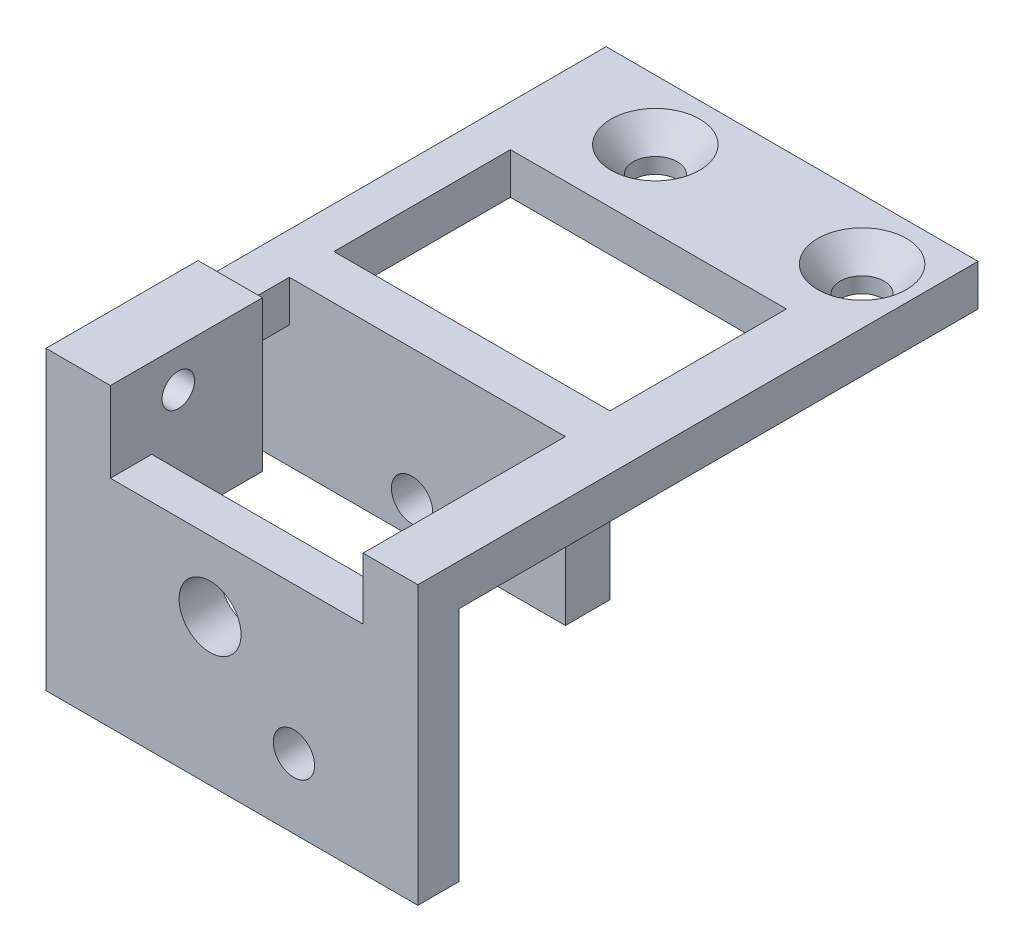
ISO-10303-21;
HEADER;
FILE_DESCRIPTION(('STEP AP214'),'2;1');
FILE_NAME('part.step','',(''),(''),'','','');
FILE_SCHEMA(('AUTOMOTIVE_DESIGN { 1 0 10303 214 1 1 1 1 }'));
ENDSEC;
DATA;
#1=APPLICATION_CONTEXT('core data for automotive mechanical design processes');
#2=APPLICATION_PROTOCOL_DEFINITION('international standard','automotive_design',2000,#1);
#3=PRODUCT_CONTEXT('',#1,'mechanical');
#4=PRODUCT('Part','Part','',(#3));
#5=PRODUCT_RELATED_PRODUCT_CATEGORY('part','',(#4));
#6=PRODUCT_DEFINITION_FORMATION('','',#4);
#7=PRODUCT_DEFINITION_CONTEXT('part definition',#1,'design');
#8=PRODUCT_DEFINITION('design','',#6,#7);
#9=PRODUCT_DEFINITION_SHAPE('','',#8);
#10=(LENGTH_UNIT() NAMED_UNIT(*) SI_UNIT(.MILLI.,.METRE.));
#11=(NAMED_UNIT(*) PLANE_ANGLE_UNIT() SI_UNIT($,.RADIAN.));
#12=(NAMED_UNIT(*) SI_UNIT($,.STERADIAN.) SOLID_ANGLE_UNIT());
#13=UNCERTAINTY_MEASURE_WITH_UNIT(LENGTH_MEASURE(1.E-05),#10,'distance_accuracy_value','');
#14=(GEOMETRIC_REPRESENTATION_CONTEXT(3) GLOBAL_UNCERTAINTY_ASSIGNED_CONTEXT((#13)) GLOBAL_UNIT_ASSIGNED_CONTEXT((#10,
#11,#12)) REPRESENTATION_CONTEXT('',''));
#15=CARTESIAN_POINT('',(0.,0.,0.));
#16=DIRECTION('',(0.,0.,1.));
#17=DIRECTION('',(1.,0.,0.));
#18=AXIS2_PLACEMENT_3D('',#15,#16,#17);
#19=CARTESIAN_POINT('',(-18.8578713163455,22.7197449567817,0.));
#20=DIRECTION('',(1.,0.,0.));
#21=DIRECTION('',(0.,0.,-1.));
#22=AXIS2_PLACEMENT_3D('',#19,#20,#21);
#23=PLANE('',#22);
#24=DIRECTION('',(0.,-1.,0.));
#25=VECTOR('',#24,1.);
#26=CARTESIAN_POINT('',(-18.8578713163455,22.7197449567817,-31.0499999999992));
#27=LINE('',#26,#25);
#28=CARTESIAN_POINT('',(-18.8578713163455,29.0697449567817,-31.0499999999992));
#29=VERTEX_POINT('',#28);
#30=CARTESIAN_POINT('',(-18.8578713163455,22.7197449567817,-31.0499999999992));
#31=VERTEX_POINT('',#30);
#32=EDGE_CURVE('E242',#29,#31,#27,.T.);
#33=ORIENTED_EDGE('',*,*,#32,.F.);
#34=DIRECTION('',(0.,0.,-1.));
#35=VECTOR('',#34,1.);
#36=CARTESIAN_POINT('',(-18.8578713163455,29.0697449567817,0.));
#37=LINE('',#36,#35);
#38=CARTESIAN_POINT('',(-18.8578713163455,29.0697449567817,-23.368));
#39=VERTEX_POINT('',#38);
#40=EDGE_CURVE('E313',#39,#29,#37,.T.);
#41=ORIENTED_EDGE('',*,*,#40,.F.);
#42=DIRECTION('',(0.,1.,0.));
#43=VECTOR('',#42,1.);
#44=CARTESIAN_POINT('',(-18.8578713163455,0.,-23.368));
#45=LINE('',#44,#43);
#46=CARTESIAN_POINT('',(-18.8578713163455,22.7197449567817,-23.368));
#47=VERTEX_POINT('',#46);
#48=EDGE_CURVE('E412',#47,#39,#45,.T.);
#49=ORIENTED_EDGE('',*,*,#48,.F.);
#50=DIRECTION('',(0.,0.,-1.));
#51=VECTOR('',#50,1.);
#52=CARTESIAN_POINT('',(-18.8578713163455,22.7197449567817,0.));
#53=LINE('',#52,#51);
#54=EDGE_CURVE('E304',#47,#31,#53,.T.);
#55=ORIENTED_EDGE('',*,*,#54,.T.);
#56=EDGE_LOOP('',(#33,#41,#49,#55));
#57=FACE_BOUND('',#56,.T.);
#58=ADVANCED_FACE('F37',(#57),#23,.T.);
#59=CARTESIAN_POINT('',(0.,22.7197449567817,0.));
#60=DIRECTION('',(0.,1.,0.));
#61=DIRECTION('',(0.,0.,1.));
#62=AXIS2_PLACEMENT_3D('',#59,#60,#61);
#63=PLANE('',#62);
#64=DIRECTION('',(0.,0.,1.));
#65=VECTOR('',#64,1.);
#66=CARTESIAN_POINT('',(-25.2078713163455,22.7197449567817,0.));
#67=LINE('',#66,#65);
#68=CARTESIAN_POINT('',(-25.2078713163455,22.7197449567817,-31.0499999999992));
#69=VERTEX_POINT('',#68);
#70=CARTESIAN_POINT('',(-25.2078713163455,22.7197449567817,-23.368));
#71=VERTEX_POINT('',#70);
#72=EDGE_CURVE('E307',#69,#71,#67,.T.);
#73=ORIENTED_EDGE('',*,*,#72,.F.);
#74=DIRECTION('',(1.,0.,0.));
#75=VECTOR('',#74,1.);
#76=CARTESIAN_POINT('',(0.,22.7197449567817,-31.0499999999992));
#77=LINE('',#76,#75);
#78=EDGE_CURVE('E239',#69,#31,#77,.T.);
#79=ORIENTED_EDGE('',*,*,#78,.T.);
#80=ORIENTED_EDGE('',*,*,#54,.F.);
#81=DIRECTION('',(-1.,0.,0.));
#82=VECTOR('',#81,1.);
#83=CARTESIAN_POINT('',(0.,22.7197449567817,-23.368));
#84=LINE('',#83,#82);
#85=EDGE_CURVE('E415',#47,#71,#84,.T.);
#86=ORIENTED_EDGE('',*,*,#85,.T.);
#87=EDGE_LOOP('',(#73,#79,#80,#86));
#88=FACE_BOUND('',#87,.T.);
#89=ADVANCED_FACE('F442',(#88),#63,.F.);
#90=CARTESIAN_POINT('',(23.5601286836545,22.7197449567817,0.));
#91=DIRECTION('',(-1.,0.,0.));
#92=DIRECTION('',(0.,0.,1.));
#93=AXIS2_PLACEMENT_3D('',#90,#91,#92);
#94=PLANE('',#93);
#95=DIRECTION('',(0.,1.,0.));
#96=VECTOR('',#95,1.);
#97=CARTESIAN_POINT('',(23.5601286836545,22.7197449567817,-31.0499999999993));
#98=LINE('',#97,#96);
#99=CARTESIAN_POINT('',(23.5601286836545,22.7197449567817,-31.0499999999993));
#100=VERTEX_POINT('',#99);
#101=CARTESIAN_POINT('',(23.5601286836545,29.0697449567817,-31.0499999999992));
#102=VERTEX_POINT('',#101);
#103=EDGE_CURVE('E11',#100,#102,#98,.T.);
#104=ORIENTED_EDGE('',*,*,#103,.F.);
#105=DIRECTION('',(0.,0.,1.));
#106=VECTOR('',#105,1.);
#107=CARTESIAN_POINT('',(23.5601286836545,22.7197449567817,0.));
#108=LINE('',#107,#106);
#109=CARTESIAN_POINT('',(23.5601286836545,22.7197449567817,-6.35));
#110=VERTEX_POINT('',#109);
#111=EDGE_CURVE('E289',#100,#110,#108,.T.);
#112=ORIENTED_EDGE('',*,*,#111,.T.);
#113=DIRECTION('',(0.,1.,0.));
#114=VECTOR('',#113,1.);
#115=CARTESIAN_POINT('',(23.5601286836545,0.,-6.35));
#116=LINE('',#115,#114);
#117=CARTESIAN_POINT('',(23.5601286836545,29.0697449567817,-6.35));
#118=VERTEX_POINT('',#117);
#119=EDGE_CURVE('E300',#110,#118,#116,.T.);
#120=ORIENTED_EDGE('',*,*,#119,.T.);
#121=DIRECTION('',(0.,0.,1.));
#122=VECTOR('',#121,1.);
#123=CARTESIAN_POINT('',(23.5601286836545,29.0697449567817,0.));
#124=LINE('',#123,#122);
#125=EDGE_CURVE('E286',#102,#118,#124,.T.);
#126=ORIENTED_EDGE('',*,*,#125,.F.);
#127=EDGE_LOOP('',(#104,#112,#120,#126));
#128=FACE_BOUND('',#127,.T.);
#129=ADVANCED_FACE('F449',(#128),#94,.T.);
#130=CARTESIAN_POINT('',(0.,0.,-23.368));
#131=DIRECTION('',(0.,0.,1.));
#132=DIRECTION('',(1.,0.,0.));
#133=AXIS2_PLACEMENT_3D('',#130,#131,#132);
#134=PLANE('',#133);
#135=ORIENTED_EDGE('',*,*,#85,.F.);
#136=ORIENTED_EDGE('',*,*,#48,.T.);
#137=DIRECTION('',(-1.,0.,0.));
#138=VECTOR('',#137,1.);
#139=CARTESIAN_POINT('',(0.,29.0697449567817,-23.368));
#140=LINE('',#139,#138);
#141=CARTESIAN_POINT('',(-25.2078713163455,29.0697449567817,-23.368));
#142=VERTEX_POINT('',#141);
#143=EDGE_CURVE('E392',#39,#142,#140,.T.);
#144=ORIENTED_EDGE('',*,*,#143,.T.);
#145=DIRECTION('',(0.,-1.,0.));
#146=VECTOR('',#145,1.);
#147=CARTESIAN_POINT('',(-25.2078713163455,0.,-23.368));
#148=LINE('',#147,#146);
#149=CARTESIAN_POINT('',(-25.2078713163455,31.9581967213115,-23.368));
#150=VERTEX_POINT('',#149);
#151=EDGE_CURVE('E325',#150,#142,#148,.T.);
#152=ORIENTED_EDGE('',*,*,#151,.F.);
#153=DIRECTION('',(-1.,0.,0.));
#154=VECTOR('',#153,1.);
#155=CARTESIAN_POINT('',(0.,31.9581967213115,-23.368));
#156=LINE('',#155,#154);
#157=CARTESIAN_POINT('',(-15.3109469053674,31.9581967213115,-23.368));
#158=VERTEX_POINT('',#157);
#159=EDGE_CURVE('E321',#158,#150,#156,.T.);
#160=ORIENTED_EDGE('',*,*,#159,.F.);
#161=DIRECTION('',(0.,-1.,0.));
#162=VECTOR('',#161,1.);
#163=CARTESIAN_POINT('',(-15.3109469053674,0.,-23.368));
#164=LINE('',#163,#162);
#165=CARTESIAN_POINT('',(-15.3109469053674,8.84419672131148,-23.368));
#166=VERTEX_POINT('',#165);
#167=EDGE_CURVE('E319',#158,#166,#164,.T.);
#168=ORIENTED_EDGE('',*,*,#167,.T.);
#169=DIRECTION('',(-1.,0.,0.));
#170=VECTOR('',#169,1.);
#171=CARTESIAN_POINT('',(0.,8.84419672131148,-23.368));
#172=LINE('',#171,#170);
#173=CARTESIAN_POINT('',(-25.2078713163455,8.84419672131148,-23.368));
#174=VERTEX_POINT('',#173);
#175=EDGE_CURVE('E312',#166,#174,#172,.T.);
#176=ORIENTED_EDGE('',*,*,#175,.T.);
#177=EDGE_CURVE('E324',#71,#174,#148,.T.);
#178=ORIENTED_EDGE('',*,*,#177,.F.);
#179=EDGE_LOOP('',(#135,#136,#144,#152,#160,#168,#176,#178));
#180=FACE_BOUND('',#179,.T.);
#181=ADVANCED_FACE('F546',(#180),#134,.F.);
#182=CARTESIAN_POINT('',(0.,0.,-6.35));
#183=DIRECTION('',(0.,0.,-1.));
#184=DIRECTION('',(-1.,0.,0.));
#185=AXIS2_PLACEMENT_3D('',#182,#183,#184);
#186=PLANE('',#185);
#187=ORIENTED_EDGE('',*,*,#119,.F.);
#188=DIRECTION('',(1.,0.,0.));
#189=VECTOR('',#188,1.);
#190=CARTESIAN_POINT('',(0.,22.7197449567817,-6.35));
#191=LINE('',#190,#189);
#192=CARTESIAN_POINT('',(31.9421286836545,22.7197449567817,-6.35));
#193=VERTEX_POINT('',#192);
#194=EDGE_CURVE('E294',#110,#193,#191,.T.);
#195=ORIENTED_EDGE('',*,*,#194,.T.);
#196=DIRECTION('',(0.,1.,0.));
#197=VECTOR('',#196,1.);
#198=CARTESIAN_POINT('',(31.9421286836545,29.0697449567817,-6.35));
#199=LINE('',#198,#197);
#200=CARTESIAN_POINT('',(31.9421286836545,-13.6022550432183,-6.35));
#201=VERTEX_POINT('',#200);
#202=EDGE_CURVE('E358',#201,#193,#199,.T.);
#203=ORIENTED_EDGE('',*,*,#202,.F.);
#204=DIRECTION('',(1.,0.,0.));
#205=VECTOR('',#204,1.);
#206=CARTESIAN_POINT('',(-25.2078713163455,-13.6022550432183,-6.35));
#207=LINE('',#206,#205);
#208=CARTESIAN_POINT('',(-25.2078713163455,-13.6022550432183,-6.35));
#209=VERTEX_POINT('',#208);
#210=EDGE_CURVE('E354',#209,#201,#207,.T.);
#211=ORIENTED_EDGE('',*,*,#210,.F.);
#212=DIRECTION('',(0.,-1.,0.));
#213=VECTOR('',#212,1.);
#214=CARTESIAN_POINT('',(-25.2078713163455,8.84419672131148,-6.35));
#215=LINE('',#214,#213);
#216=CARTESIAN_POINT('',(-25.2078713163455,8.84419672131148,-6.35));
#217=VERTEX_POINT('',#216);
#218=EDGE_CURVE('E352',#217,#209,#215,.T.);
#219=ORIENTED_EDGE('',*,*,#218,.F.);
#220=DIRECTION('',(1.,0.,0.));
#221=VECTOR('',#220,1.);
#222=CARTESIAN_POINT('',(0.,8.84419672131148,-6.35));
#223=LINE('',#222,#221);
#224=CARTESIAN_POINT('',(-15.3109469053674,8.84419672131148,-6.35));
#225=VERTEX_POINT('',#224);
#226=EDGE_CURVE('E336',#217,#225,#223,.T.);
#227=ORIENTED_EDGE('',*,*,#226,.T.);
#228=DIRECTION('',(0.,1.,0.));
#229=VECTOR('',#228,1.);
#230=CARTESIAN_POINT('',(-15.3109469053674,0.,-6.35));
#231=LINE('',#230,#229);
#232=CARTESIAN_POINT('',(-15.3109469053674,19.6202999936889,-6.35));
#233=VERTEX_POINT('',#232);
#234=EDGE_CURVE('E332',#225,#233,#231,.T.);
#235=ORIENTED_EDGE('',*,*,#234,.T.);
#236=DIRECTION('',(-1.,0.,0.));
#237=VECTOR('',#236,1.);
#238=CARTESIAN_POINT('',(-15.3109469053674,19.6202999936889,-6.35));
#239=LINE('',#238,#237);
#240=CARTESIAN_POINT('',(23.5226051795746,19.6202999936889,-6.35));
#241=VERTEX_POINT('',#240);
#242=EDGE_CURVE('E365',#241,#233,#239,.T.);
#243=ORIENTED_EDGE('',*,*,#242,.F.);
#244=DIRECTION('',(0.,-1.,0.));
#245=VECTOR('',#244,1.);
#246=CARTESIAN_POINT('',(23.5226051795746,22.6564717057016,-6.35));
#247=LINE('',#246,#245);
#248=CARTESIAN_POINT('',(23.5226051795746,29.0697449567817,-6.35));
#249=VERTEX_POINT('',#248);
#250=EDGE_CURVE('E363',#249,#241,#247,.T.);
#251=ORIENTED_EDGE('',*,*,#250,.F.);
#252=DIRECTION('',(-1.,0.,0.));
#253=VECTOR('',#252,1.);
#254=CARTESIAN_POINT('',(23.5226051795746,29.0697449567817,-6.35));
#255=LINE('',#254,#253);
#256=EDGE_CURVE('E361',#118,#249,#255,.T.);
#257=ORIENTED_EDGE('',*,*,#256,.F.);
#258=EDGE_LOOP('',(#187,#195,#203,#211,#219,#227,#235,#243,#251,#257));
#259=FACE_BOUND('',#258,.T.);
#260=CARTESIAN_POINT('',(6.65235973945633E-08,8.84419672131148,-6.35));
#261=DIRECTION('',(0.,0.,1.));
#262=DIRECTION('',(1.,0.,0.));
#263=AXIS2_PLACEMENT_3D('',#260,#261,#262);
#264=CIRCLE('',#263,4.76249999893999);
#265=CARTESIAN_POINT('',(4.76250006546358,8.84419672131148,-6.35));
#266=VERTEX_POINT('',#265);
#267=EDGE_CURVE('E340',#266,#266,#264,.T.);
#268=ORIENTED_EDGE('',*,*,#267,.T.);
#269=EDGE_LOOP('',(#268));
#270=FACE_BOUND('',#269,.T.);
#271=CARTESIAN_POINT('',(12.8921286836545,-2.93425504321831,-6.35));
#272=DIRECTION('',(0.,0.,1.));
#273=DIRECTION('',(1.,0.,0.));
#274=AXIS2_PLACEMENT_3D('',#271,#272,#273);
#275=CIRCLE('',#274,3.175);
#276=CARTESIAN_POINT('',(16.0671286836545,-2.93425504321831,-6.35));
#277=VERTEX_POINT('',#276);
#278=EDGE_CURVE('E346',#277,#277,#275,.T.);
#279=ORIENTED_EDGE('',*,*,#278,.T.);
#280=EDGE_LOOP('',(#279));
#281=FACE_BOUND('',#280,.T.);
#282=ADVANCED_FACE('F521',(#259,#270,#281),#186,.T.);
#283=CARTESIAN_POINT('',(-25.2078713163455,31.9581967213115,-6.35));
#284=DIRECTION('',(0.,1.,0.));
#285=DIRECTION('',(0.,0.,1.));
#286=AXIS2_PLACEMENT_3D('',#283,#284,#285);
#287=PLANE('',#286);
#288=DIRECTION('',(-1.,0.,0.));
#289=VECTOR('',#288,1.);
#290=CARTESIAN_POINT('',(-25.2078713163455,31.9581967213115,0.));
#291=LINE('',#290,#289);
#292=CARTESIAN_POINT('',(-15.3109469053674,31.9581967213115,0.));
#293=VERTEX_POINT('',#292);
#294=CARTESIAN_POINT('',(-25.2078713163455,31.9581967213115,0.));
#295=VERTEX_POINT('',#294);
#296=EDGE_CURVE('E355',#293,#295,#291,.T.);
#297=ORIENTED_EDGE('',*,*,#296,.F.);
#298=DIRECTION('',(0.,0.,1.));
#299=VECTOR('',#298,1.);
#300=CARTESIAN_POINT('',(-15.3109469053674,31.9581967213115,-6.35));
#301=LINE('',#300,#299);
#302=EDGE_CURVE('E393',#158,#293,#301,.T.);
#303=ORIENTED_EDGE('',*,*,#302,.F.);
#304=ORIENTED_EDGE('',*,*,#159,.T.);
#305=DIRECTION('',(0.,0.,1.));
#306=VECTOR('',#305,1.);
#307=CARTESIAN_POINT('',(-25.2078713163455,31.9581967213115,-6.35));
#308=LINE('',#307,#306);
#309=EDGE_CURVE('E389',#150,#295,#308,.T.);
#310=ORIENTED_EDGE('',*,*,#309,.T.);
#311=EDGE_LOOP('',(#297,#303,#304,#310));
#312=FACE_BOUND('',#311,.T.);
#313=ADVANCED_FACE('F541',(#312),#287,.T.);
#314=CARTESIAN_POINT('',(-15.3109469053674,31.9581967213115,-6.35));
#315=DIRECTION('',(1.,0.,0.));
#316=DIRECTION('',(0.,0.,-1.));
#317=AXIS2_PLACEMENT_3D('',#314,#315,#316);
#318=PLANE('',#317);
#319=CARTESIAN_POINT('',(-15.3109469053674,26.1623070820462,-10.4374991238568));
#320=DIRECTION('',(1.,0.,0.));
#321=DIRECTION('',(0.,0.,-1.));
#322=AXIS2_PLACEMENT_3D('',#319,#320,#321);
#323=CIRCLE('',#322,2.50000000000162);
#324=CARTESIAN_POINT('',(-15.3109469053674,26.1623070820462,-12.9374991238585));
#325=VERTEX_POINT('',#324);
#326=EDGE_CURVE('E280',#325,#325,#323,.F.);
#327=ORIENTED_EDGE('',*,*,#326,.T.);
#328=EDGE_LOOP('',(#327));
#329=FACE_BOUND('',#328,.T.);
#330=DIRECTION('',(0.,1.,0.));
#331=VECTOR('',#330,1.);
#332=CARTESIAN_POINT('',(-15.3109469053674,31.9581967213115,0.));
#333=LINE('',#332,#331);
#334=CARTESIAN_POINT('',(-15.3109469053674,19.6202999936889,0.));
#335=VERTEX_POINT('',#334);
#336=EDGE_CURVE('E384',#335,#293,#333,.T.);
#337=ORIENTED_EDGE('',*,*,#336,.F.);
#338=DIRECTION('',(0.,0.,1.));
#339=VECTOR('',#338,1.);
#340=CARTESIAN_POINT('',(-15.3109469053674,19.6202999936889,-6.35));
#341=LINE('',#340,#339);
#342=EDGE_CURVE('E396',#233,#335,#341,.T.);
#343=ORIENTED_EDGE('',*,*,#342,.F.);
#344=ORIENTED_EDGE('',*,*,#234,.F.);
#345=DIRECTION('',(0.,0.,1.));
#346=VECTOR('',#345,1.);
#347=CARTESIAN_POINT('',(-15.3109469053674,8.84419672131148,-23.368));
#348=LINE('',#347,#346);
#349=EDGE_CURVE('E328',#166,#225,#348,.T.);
#350=ORIENTED_EDGE('',*,*,#349,.F.);
#351=ORIENTED_EDGE('',*,*,#167,.F.);
#352=ORIENTED_EDGE('',*,*,#302,.T.);
#353=EDGE_LOOP('',(#337,#343,#344,#350,#351,#352));
#354=FACE_BOUND('',#353,.T.);
#355=ADVANCED_FACE('F536',(#329,#354),#318,.T.);
#356=CARTESIAN_POINT('',(-15.3109469053674,19.6202999936889,-6.35));
#357=DIRECTION('',(0.,1.,0.));
#358=DIRECTION('',(0.,0.,1.));
#359=AXIS2_PLACEMENT_3D('',#356,#357,#358);
#360=PLANE('',#359);
#361=DIRECTION('',(-1.,0.,0.));
#362=VECTOR('',#361,1.);
#363=CARTESIAN_POINT('',(-15.3109469053674,19.6202999936889,0.));
#364=LINE('',#363,#362);
#365=CARTESIAN_POINT('',(23.5226051795746,19.6202999936889,0.));
#366=VERTEX_POINT('',#365);
#367=EDGE_CURVE('E381',#366,#335,#364,.T.);
#368=ORIENTED_EDGE('',*,*,#367,.F.);
#369=DIRECTION('',(0.,0.,1.));
#370=VECTOR('',#369,1.);
#371=CARTESIAN_POINT('',(23.5226051795746,19.6202999936889,-6.35));
#372=LINE('',#371,#370);
#373=EDGE_CURVE('E399',#241,#366,#372,.T.);
#374=ORIENTED_EDGE('',*,*,#373,.F.);
#375=ORIENTED_EDGE('',*,*,#242,.T.);
#376=ORIENTED_EDGE('',*,*,#342,.T.);
#377=EDGE_LOOP('',(#368,#374,#375,#376));
#378=FACE_BOUND('',#377,.T.);
#379=ADVANCED_FACE('F498',(#378),#360,.T.);
#380=CARTESIAN_POINT('',(23.5226051795746,19.6202999936889,-6.35));
#381=DIRECTION('',(-1.,0.,0.));
#382=DIRECTION('',(0.,0.,1.));
#383=AXIS2_PLACEMENT_3D('',#380,#381,#382);
#384=PLANE('',#383);
#385=DIRECTION('',(0.,-1.,0.));
#386=VECTOR('',#385,1.);
#387=CARTESIAN_POINT('',(23.5226051795746,19.6202999936889,0.));
#388=LINE('',#387,#386);
#389=CARTESIAN_POINT('',(23.5226051795746,29.0697449567817,0.));
#390=VERTEX_POINT('',#389);
#391=EDGE_CURVE('E378',#390,#366,#388,.T.);
#392=ORIENTED_EDGE('',*,*,#391,.F.);
#393=DIRECTION('',(0.,0.,1.));
#394=VECTOR('',#393,1.);
#395=CARTESIAN_POINT('',(23.5226051795746,29.0697449567817,-6.35));
#396=LINE('',#395,#394);
#397=EDGE_CURVE('E401',#249,#390,#396,.T.);
#398=ORIENTED_EDGE('',*,*,#397,.F.);
#399=ORIENTED_EDGE('',*,*,#250,.T.);
#400=ORIENTED_EDGE('',*,*,#373,.T.);
#401=EDGE_LOOP('',(#392,#398,#399,#400));
#402=FACE_BOUND('',#401,.T.);
#403=ADVANCED_FACE('F484',(#402),#384,.T.);
#404=CARTESIAN_POINT('',(23.5226051795746,29.0697449567817,-6.35));
#405=DIRECTION('',(0.,1.,0.));
#406=DIRECTION('',(0.,0.,1.));
#407=AXIS2_PLACEMENT_3D('',#404,#405,#406);
#408=PLANE('',#407);
#409=DIRECTION('',(0.,0.,1.));
#410=VECTOR('',#409,1.);
#411=CARTESIAN_POINT('',(-25.2078713163455,29.0697449567817,0.));
#412=LINE('',#411,#410);
#413=CARTESIAN_POINT('',(-25.2078713163455,29.0697449567817,-86.0813347367588));
#414=VERTEX_POINT('',#413);
#415=EDGE_CURVE('E315',#414,#142,#412,.T.);
#416=ORIENTED_EDGE('',*,*,#415,.T.);
#417=ORIENTED_EDGE('',*,*,#143,.F.);
#418=ORIENTED_EDGE('',*,*,#40,.T.);
#419=DIRECTION('',(1.,0.,0.));
#420=VECTOR('',#419,1.);
#421=CARTESIAN_POINT('',(23.5601286836545,29.0697449567817,-31.0499999999993));
#422=LINE('',#421,#420);
#423=EDGE_CURVE('E60',#29,#102,#422,.T.);
#424=ORIENTED_EDGE('',*,*,#423,.T.);
#425=ORIENTED_EDGE('',*,*,#125,.T.);
#426=ORIENTED_EDGE('',*,*,#256,.T.);
#427=ORIENTED_EDGE('',*,*,#397,.T.);
#428=DIRECTION('',(-1.,0.,0.));
#429=VECTOR('',#428,1.);
#430=CARTESIAN_POINT('',(23.5226051795746,29.0697449567817,0.));
#431=LINE('',#430,#429);
#432=CARTESIAN_POINT('',(31.9421286836545,29.0697449567817,0.));
#433=VERTEX_POINT('',#432);
#434=EDGE_CURVE('E376',#433,#390,#431,.T.);
#435=ORIENTED_EDGE('',*,*,#434,.F.);
#436=DIRECTION('',(0.,0.,1.));
#437=VECTOR('',#436,1.);
#438=CARTESIAN_POINT('',(31.9421286836545,29.0697449567817,-6.35));
#439=LINE('',#438,#437);
#440=CARTESIAN_POINT('',(31.9421286836545,29.0697449567817,-86.0813347367588));
#441=VERTEX_POINT('',#440);
#442=EDGE_CURVE('E404',#441,#433,#439,.T.);
#443=ORIENTED_EDGE('',*,*,#442,.F.);
#444=DIRECTION('',(-1.,0.,0.));
#445=VECTOR('',#444,1.);
#446=CARTESIAN_POINT('',(-25.2078713163455,29.0697449567817,-86.0813347367588));
#447=LINE('',#446,#445);
#448=EDGE_CURVE('E261',#441,#414,#447,.T.);
#449=ORIENTED_EDGE('',*,*,#448,.T.);
#450=EDGE_LOOP('',(#416,#417,#418,#424,#425,#426,#427,#435,#443,#449));
#451=FACE_BOUND('',#450,.T.);
#452=DIRECTION('',(-1.,0.,0.));
#453=VECTOR('',#452,1.);
#454=CARTESIAN_POINT('',(-25.2078713163455,29.0697449567817,-37.8930398949065));
#455=LINE('',#454,#453);
#456=CARTESIAN_POINT('',(23.5601286836545,29.0697449567817,-37.8930398949065));
#457=VERTEX_POINT('',#456);
#458=CARTESIAN_POINT('',(-18.8578713163455,29.0697449567817,-37.8930398949065));
#459=VERTEX_POINT('',#458);
#460=EDGE_CURVE('E219',#457,#459,#455,.T.);
#461=ORIENTED_EDGE('',*,*,#460,.T.);
#462=CARTESIAN_POINT('',(-18.8578713163455,29.0697449567817,-65.022649662));
#463=VERTEX_POINT('',#462);
#464=EDGE_CURVE('E303',#459,#463,#37,.T.);
#465=ORIENTED_EDGE('',*,*,#464,.T.);
#466=DIRECTION('',(1.,0.,0.));
#467=VECTOR('',#466,1.);
#468=CARTESIAN_POINT('',(-25.2078713163455,29.0697449567817,-65.022649662));
#469=LINE('',#468,#467);
#470=CARTESIAN_POINT('',(23.5601286836545,29.0697449567817,-65.022649662));
#471=VERTEX_POINT('',#470);
#472=EDGE_CURVE('E265',#463,#471,#469,.T.);
#473=ORIENTED_EDGE('',*,*,#472,.T.);
#474=EDGE_CURVE('E290',#471,#457,#124,.T.);
#475=ORIENTED_EDGE('',*,*,#474,.T.);
#476=EDGE_LOOP('',(#461,#465,#473,#475));
#477=FACE_BOUND('',#476,.T.);
#478=CARTESIAN_POINT('',(-8.3847403857249,29.0697449567817,-76.8190206778401));
#479=DIRECTION('',(0.,1.,0.));
#480=DIRECTION('',(0.,0.,1.));
#481=AXIS2_PLACEMENT_3D('',#478,#479,#480);
#482=CIRCLE('',#481,6.8199);
#483=CARTESIAN_POINT('',(-8.3847403857249,29.0697449567817,-69.9991206778401));
#484=VERTEX_POINT('',#483);
#485=EDGE_CURVE('E244',#484,#484,#482,.T.);
#486=ORIENTED_EDGE('',*,*,#485,.F.);
#487=EDGE_LOOP('',(#486));
#488=FACE_BOUND('',#487,.T.);
#489=CARTESIAN_POINT('',(23.3942493943793,29.0697449567817,-76.8190206778401));
#490=DIRECTION('',(0.,1.,0.));
#491=DIRECTION('',(0.,0.,1.));
#492=AXIS2_PLACEMENT_3D('',#489,#490,#491);
#493=CIRCLE('',#492,6.8199);
#494=CARTESIAN_POINT('',(23.3942493943793,29.0697449567817,-69.9991206778401));
#495=VERTEX_POINT('',#494);
#496=EDGE_CURVE('E251',#495,#495,#493,.T.);
#497=ORIENTED_EDGE('',*,*,#496,.F.);
#498=EDGE_LOOP('',(#497));
#499=FACE_BOUND('',#498,.T.);
#500=ADVANCED_FACE('F480',(#451,#477,#488,#499),#408,.T.);
#501=CARTESIAN_POINT('',(31.9421286836545,29.0697449567817,-6.35));
#502=DIRECTION('',(1.,0.,0.));
#503=DIRECTION('',(0.,1.,0.));
#504=AXIS2_PLACEMENT_3D('',#501,#502,#503);
#505=PLANE('',#504);
#506=DIRECTION('',(0.,0.,-1.));
#507=VECTOR('',#506,1.);
#508=CARTESIAN_POINT('',(31.9421286836545,22.7197449567817,0.));
#509=LINE('',#508,#507);
#510=CARTESIAN_POINT('',(31.9421286836545,22.7197449567817,-86.0813347367588));
#511=VERTEX_POINT('',#510);
#512=EDGE_CURVE('E287',#193,#511,#509,.T.);
#513=ORIENTED_EDGE('',*,*,#512,.T.);
#514=DIRECTION('',(0.,1.,0.));
#515=VECTOR('',#514,1.);
#516=CARTESIAN_POINT('',(31.9421286836545,22.7197449567817,-86.0813347367588));
#517=LINE('',#516,#515);
#518=EDGE_CURVE('E264',#511,#441,#517,.T.);
#519=ORIENTED_EDGE('',*,*,#518,.T.);
#520=ORIENTED_EDGE('',*,*,#442,.T.);
#521=DIRECTION('',(0.,1.,0.));
#522=VECTOR('',#521,1.);
#523=CARTESIAN_POINT('',(31.9421286836545,29.0697449567817,0.));
#524=LINE('',#523,#522);
#525=CARTESIAN_POINT('',(31.9421286836545,-13.6022550432183,0.));
#526=VERTEX_POINT('',#525);
#527=EDGE_CURVE('E373',#526,#433,#524,.T.);
#528=ORIENTED_EDGE('',*,*,#527,.F.);
#529=DIRECTION('',(0.,0.,1.));
#530=VECTOR('',#529,1.);
#531=CARTESIAN_POINT('',(31.9421286836545,-13.6022550432183,-6.35));
#532=LINE('',#531,#530);
#533=EDGE_CURVE('E406',#201,#526,#532,.T.);
#534=ORIENTED_EDGE('',*,*,#533,.F.);
#535=ORIENTED_EDGE('',*,*,#202,.T.);
#536=EDGE_LOOP('',(#513,#519,#520,#528,#534,#535));
#537=FACE_BOUND('',#536,.T.);
#538=ADVANCED_FACE('F483',(#537),#505,.T.);
#539=CARTESIAN_POINT('',(-25.2078713163455,-13.6022550432183,-6.35));
#540=DIRECTION('',(0.,-1.,0.));
#541=DIRECTION('',(1.,0.,0.));
#542=AXIS2_PLACEMENT_3D('',#539,#540,#541);
#543=PLANE('',#542);
#544=DIRECTION('',(1.,0.,0.));
#545=VECTOR('',#544,1.);
#546=CARTESIAN_POINT('',(-25.2078713163455,-13.6022550432183,0.));
#547=LINE('',#546,#545);
#548=CARTESIAN_POINT('',(-25.2078713163455,-13.6022550432183,0.));
#549=VERTEX_POINT('',#548);
#550=EDGE_CURVE('E370',#549,#526,#547,.T.);
#551=ORIENTED_EDGE('',*,*,#550,.F.);
#552=DIRECTION('',(0.,0.,1.));
#553=VECTOR('',#552,1.);
#554=CARTESIAN_POINT('',(-25.2078713163455,-13.6022550432183,-6.35));
#555=LINE('',#554,#553);
#556=EDGE_CURVE('E368',#209,#549,#555,.T.);
#557=ORIENTED_EDGE('',*,*,#556,.F.);
#558=ORIENTED_EDGE('',*,*,#210,.T.);
#559=ORIENTED_EDGE('',*,*,#533,.T.);
#560=EDGE_LOOP('',(#551,#557,#558,#559));
#561=FACE_BOUND('',#560,.T.);
#562=ADVANCED_FACE('F495',(#561),#543,.T.);
#563=CARTESIAN_POINT('',(-25.2078713163455,8.84419672131148,-6.35));
#564=DIRECTION('',(-1.,0.,0.));
#565=DIRECTION('',(0.,-1.,0.));
#566=AXIS2_PLACEMENT_3D('',#563,#564,#565);
#567=PLANE('',#566);
#568=CARTESIAN_POINT('',(-25.2078713163455,22.7197449567817,-86.0813347367588));
#569=VERTEX_POINT('',#568);
#570=CARTESIAN_POINT('',(-25.2078713163455,22.7197449567817,-37.8930398949065));
#571=VERTEX_POINT('',#570);
#572=EDGE_CURVE('E309',#569,#571,#67,.T.);
#573=ORIENTED_EDGE('',*,*,#572,.T.);
#574=DIRECTION('',(0.,1.,0.));
#575=VECTOR('',#574,1.);
#576=CARTESIAN_POINT('',(-25.2078713163455,3.92374495678167,-37.8930398949065));
#577=LINE('',#576,#575);
#578=CARTESIAN_POINT('',(-25.2078713163455,3.92374495678167,-37.8930398949065));
#579=VERTEX_POINT('',#578);
#580=EDGE_CURVE('E52',#579,#571,#577,.T.);
#581=ORIENTED_EDGE('',*,*,#580,.F.);
#582=DIRECTION('',(0.,0.,1.));
#583=VECTOR('',#582,1.);
#584=CARTESIAN_POINT('',(-25.2078713163455,3.92374495678167,-37.8930398949065));
#585=LINE('',#584,#583);
#586=CARTESIAN_POINT('',(-25.2078713163455,3.92374495678167,-31.0499999999992));
#587=VERTEX_POINT('',#586);
#588=EDGE_CURVE('E213',#579,#587,#585,.T.);
#589=ORIENTED_EDGE('',*,*,#588,.T.);
#590=DIRECTION('',(0.,1.,0.));
#591=VECTOR('',#590,1.);
#592=CARTESIAN_POINT('',(-25.2078713163455,3.92374495678167,-31.0499999999992));
#593=LINE('',#592,#591);
#594=EDGE_CURVE('E232',#587,#69,#593,.T.);
#595=ORIENTED_EDGE('',*,*,#594,.T.);
#596=ORIENTED_EDGE('',*,*,#72,.T.);
#597=ORIENTED_EDGE('',*,*,#177,.T.);
#598=DIRECTION('',(0.,0.,1.));
#599=VECTOR('',#598,1.);
#600=CARTESIAN_POINT('',(-25.2078713163455,8.84419672131148,-23.368));
#601=LINE('',#600,#599);
#602=EDGE_CURVE('E329',#174,#217,#601,.T.);
#603=ORIENTED_EDGE('',*,*,#602,.T.);
#604=ORIENTED_EDGE('',*,*,#218,.T.);
#605=ORIENTED_EDGE('',*,*,#556,.T.);
#606=DIRECTION('',(0.,-1.,0.));
#607=VECTOR('',#606,1.);
#608=CARTESIAN_POINT('',(-25.2078713163455,8.84419672131148,0.));
#609=LINE('',#608,#607);
#610=EDGE_CURVE('E349',#295,#549,#609,.T.);
#611=ORIENTED_EDGE('',*,*,#610,.F.);
#612=ORIENTED_EDGE('',*,*,#309,.F.);
#613=ORIENTED_EDGE('',*,*,#151,.T.);
#614=ORIENTED_EDGE('',*,*,#415,.F.);
#615=DIRECTION('',(0.,1.,0.));
#616=VECTOR('',#615,1.);
#617=CARTESIAN_POINT('',(-25.2078713163455,22.7197449567817,-86.0813347367588));
#618=LINE('',#617,#616);
#619=EDGE_CURVE('E270',#569,#414,#618,.T.);
#620=ORIENTED_EDGE('',*,*,#619,.F.);
#621=EDGE_LOOP('',(#573,#581,#589,#595,#596,#597,#603,#604,#605,#611,#612,#613,#614,#620));
#622=FACE_BOUND('',#621,.T.);
#623=CARTESIAN_POINT('',(-25.2078713163455,26.1623070820463,-10.4374991238568));
#624=DIRECTION('',(-1.,0.,0.));
#625=DIRECTION('',(0.,-1.,0.));
#626=AXIS2_PLACEMENT_3D('',#623,#624,#625);
#627=CIRCLE('',#626,2.50000000000162);
#628=CARTESIAN_POINT('',(-25.2078713163455,23.6623070820446,-10.4374991238568));
#629=VERTEX_POINT('',#628);
#630=EDGE_CURVE('E283',#629,#629,#627,.T.);
#631=ORIENTED_EDGE('',*,*,#630,.F.);
#632=EDGE_LOOP('',(#631));
#633=FACE_BOUND('',#632,.T.);
#634=ADVANCED_FACE('F39',(#622,#633),#567,.T.);
#635=CARTESIAN_POINT('',(0.,0.,0.));
#636=DIRECTION('',(0.,0.,-1.));
#637=DIRECTION('',(-1.,0.,0.));
#638=AXIS2_PLACEMENT_3D('',#635,#636,#637);
#639=PLANE('',#638);
#640=ORIENTED_EDGE('',*,*,#434,.T.);
#641=ORIENTED_EDGE('',*,*,#391,.T.);
#642=ORIENTED_EDGE('',*,*,#367,.T.);
#643=ORIENTED_EDGE('',*,*,#336,.T.);
#644=ORIENTED_EDGE('',*,*,#296,.T.);
#645=ORIENTED_EDGE('',*,*,#610,.T.);
#646=ORIENTED_EDGE('',*,*,#550,.T.);
#647=ORIENTED_EDGE('',*,*,#527,.T.);
#648=EDGE_LOOP('',(#640,#641,#642,#643,#644,#645,#646,#647));
#649=FACE_BOUND('',#648,.T.);
#650=CARTESIAN_POINT('',(6.65235973945633E-08,8.84419672131148,0.));
#651=DIRECTION('',(0.,0.,1.));
#652=DIRECTION('',(1.,0.,0.));
#653=AXIS2_PLACEMENT_3D('',#650,#651,#652);
#654=CIRCLE('',#653,4.76249999893999);
#655=CARTESIAN_POINT('',(4.76250006546358,8.84419672131148,0.));
#656=VERTEX_POINT('',#655);
#657=EDGE_CURVE('E339',#656,#656,#654,.T.);
#658=ORIENTED_EDGE('',*,*,#657,.F.);
#659=EDGE_LOOP('',(#658));
#660=FACE_BOUND('',#659,.T.);
#661=CARTESIAN_POINT('',(12.8921286836545,-2.93425504321831,0.));
#662=DIRECTION('',(0.,0.,1.));
#663=DIRECTION('',(1.,0.,0.));
#664=AXIS2_PLACEMENT_3D('',#661,#662,#663);
#665=CIRCLE('',#664,3.175);
#666=CARTESIAN_POINT('',(16.0671286836545,-2.93425504321831,0.));
#667=VERTEX_POINT('',#666);
#668=EDGE_CURVE('E343',#667,#667,#665,.T.);
#669=ORIENTED_EDGE('',*,*,#668,.F.);
#670=EDGE_LOOP('',(#669));
#671=FACE_BOUND('',#670,.T.);
#672=ADVANCED_FACE('F507',(#649,#660,#671),#639,.F.);
#673=CARTESIAN_POINT('',(12.8921286836545,-2.93425504321831,-6.35));
#674=DIRECTION('',(0.,0.,1.));
#675=DIRECTION('',(1.,0.,0.));
#676=AXIS2_PLACEMENT_3D('',#673,#674,#675);
#677=CYLINDRICAL_SURFACE('',#676,3.175);
#678=ORIENTED_EDGE('',*,*,#278,.F.);
#679=EDGE_LOOP('',(#678));
#680=FACE_BOUND('',#679,.T.);
#681=ORIENTED_EDGE('',*,*,#668,.T.);
#682=EDGE_LOOP('',(#681));
#683=FACE_BOUND('',#682,.T.);
#684=ADVANCED_FACE('F587',(#680,#683),#677,.F.);
#685=CARTESIAN_POINT('',(6.65235973945633E-08,8.84419672131148,-6.35));
#686=DIRECTION('',(0.,0.,1.));
#687=DIRECTION('',(1.,0.,0.));
#688=AXIS2_PLACEMENT_3D('',#685,#686,#687);
#689=CYLINDRICAL_SURFACE('',#688,4.76249999893999);
#690=ORIENTED_EDGE('',*,*,#267,.F.);
#691=EDGE_LOOP('',(#690));
#692=FACE_BOUND('',#691,.T.);
#693=ORIENTED_EDGE('',*,*,#657,.T.);
#694=EDGE_LOOP('',(#693));
#695=FACE_BOUND('',#694,.T.);
#696=ADVANCED_FACE('F463',(#692,#695),#689,.F.);
#697=CARTESIAN_POINT('',(0.,8.84419672131148,-23.368));
#698=DIRECTION('',(0.,1.,0.));
#699=DIRECTION('',(-1.,0.,0.));
#700=AXIS2_PLACEMENT_3D('',#697,#698,#699);
#701=PLANE('',#700);
#702=ORIENTED_EDGE('',*,*,#226,.F.);
#703=ORIENTED_EDGE('',*,*,#602,.F.);
#704=ORIENTED_EDGE('',*,*,#175,.F.);
#705=ORIENTED_EDGE('',*,*,#349,.T.);
#706=EDGE_LOOP('',(#702,#703,#704,#705));
#707=FACE_BOUND('',#706,.T.);
#708=ADVANCED_FACE('F456',(#707),#701,.F.);
#709=DIRECTION('',(0.,1.,0.));
#710=VECTOR('',#709,1.);
#711=CARTESIAN_POINT('',(-18.8578713163455,22.7197449567817,-37.8930398949065));
#712=LINE('',#711,#710);
#713=CARTESIAN_POINT('',(-18.8578713163455,22.7197449567817,-37.8930398949065));
#714=VERTEX_POINT('',#713);
#715=EDGE_CURVE('E237',#714,#459,#712,.T.);
#716=ORIENTED_EDGE('',*,*,#715,.F.);
#717=CARTESIAN_POINT('',(-18.8578713163455,22.7197449567817,-65.022649662));
#718=VERTEX_POINT('',#717);
#719=EDGE_CURVE('E308',#714,#718,#53,.T.);
#720=ORIENTED_EDGE('',*,*,#719,.T.);
#721=DIRECTION('',(0.,-1.,0.));
#722=VECTOR('',#721,1.);
#723=CARTESIAN_POINT('',(-18.8578713163455,22.7197449567817,-65.022649662));
#724=LINE('',#723,#722);
#725=EDGE_CURVE('E277',#463,#718,#724,.T.);
#726=ORIENTED_EDGE('',*,*,#725,.F.);
#727=ORIENTED_EDGE('',*,*,#464,.F.);
#728=EDGE_LOOP('',(#716,#720,#726,#727));
#729=FACE_BOUND('',#728,.T.);
#730=ADVANCED_FACE('F445',(#729),#23,.T.);
#731=CARTESIAN_POINT('',(-8.3847403857249,22.7197449567817,-76.8190206778401));
#732=DIRECTION('',(0.,1.,0.));
#733=DIRECTION('',(0.,0.,1.));
#734=AXIS2_PLACEMENT_3D('',#731,#732,#733);
#735=CIRCLE('',#734,3.37819999999999);
#736=CARTESIAN_POINT('',(-8.3847403857249,22.7197449567817,-73.4408206778401));
#737=VERTEX_POINT('',#736);
#738=EDGE_CURVE('E250',#737,#737,#735,.T.);
#739=ORIENTED_EDGE('',*,*,#738,.T.);
#740=EDGE_LOOP('',(#739));
#741=FACE_BOUND('',#740,.T.);
#742=CARTESIAN_POINT('',(23.3942493943793,22.7197449567817,-76.8190206778401));
#743=DIRECTION('',(0.,1.,0.));
#744=DIRECTION('',(0.,0.,1.));
#745=AXIS2_PLACEMENT_3D('',#742,#743,#744);
#746=CIRCLE('',#745,3.37819999999999);
#747=CARTESIAN_POINT('',(23.3942493943793,22.7197449567817,-73.4408206778401));
#748=VERTEX_POINT('',#747);
#749=EDGE_CURVE('E257',#748,#748,#746,.T.);
#750=ORIENTED_EDGE('',*,*,#749,.T.);
#751=EDGE_LOOP('',(#750));
#752=FACE_BOUND('',#751,.T.);
#753=ORIENTED_EDGE('',*,*,#719,.F.);
#754=DIRECTION('',(-1.,0.,0.));
#755=VECTOR('',#754,1.);
#756=CARTESIAN_POINT('',(0.,22.7197449567817,-37.8930398949065));
#757=LINE('',#756,#755);
#758=EDGE_CURVE('E231',#714,#571,#757,.T.);
#759=ORIENTED_EDGE('',*,*,#758,.T.);
#760=ORIENTED_EDGE('',*,*,#572,.F.);
#761=DIRECTION('',(-1.,0.,0.));
#762=VECTOR('',#761,1.);
#763=CARTESIAN_POINT('',(-25.2078713163455,22.7197449567817,-86.0813347367588));
#764=LINE('',#763,#762);
#765=EDGE_CURVE('E260',#511,#569,#764,.T.);
#766=ORIENTED_EDGE('',*,*,#765,.F.);
#767=ORIENTED_EDGE('',*,*,#512,.F.);
#768=ORIENTED_EDGE('',*,*,#194,.F.);
#769=ORIENTED_EDGE('',*,*,#111,.F.);
#770=CARTESIAN_POINT('',(23.5601286836545,22.7197449567817,-37.8930398949065));
#771=VERTEX_POINT('',#770);
#772=EDGE_CURVE('E295',#771,#100,#108,.T.);
#773=ORIENTED_EDGE('',*,*,#772,.F.);
#774=CARTESIAN_POINT('',(23.5601286836545,22.7197449567817,-65.022649662));
#775=VERTEX_POINT('',#774);
#776=EDGE_CURVE('E291',#775,#771,#108,.T.);
#777=ORIENTED_EDGE('',*,*,#776,.F.);
#778=DIRECTION('',(1.,0.,0.));
#779=VECTOR('',#778,1.);
#780=CARTESIAN_POINT('',(-25.2078713163455,22.7197449567817,-65.022649662));
#781=LINE('',#780,#779);
#782=EDGE_CURVE('E258',#718,#775,#781,.T.);
#783=ORIENTED_EDGE('',*,*,#782,.F.);
#784=EDGE_LOOP('',(#753,#759,#760,#766,#767,#768,#769,#773,#777,#783));
#785=FACE_BOUND('',#784,.T.);
#786=ADVANCED_FACE('F423',(#741,#752,#785),#63,.F.);
#787=DIRECTION('',(0.,-1.,0.));
#788=VECTOR('',#787,1.);
#789=CARTESIAN_POINT('',(23.5601286836545,22.7197449567817,-37.8930398949065));
#790=LINE('',#789,#788);
#791=EDGE_CURVE('E45',#457,#771,#790,.T.);
#792=ORIENTED_EDGE('',*,*,#791,.F.);
#793=ORIENTED_EDGE('',*,*,#474,.F.);
#794=DIRECTION('',(0.,1.,0.));
#795=VECTOR('',#794,1.);
#796=CARTESIAN_POINT('',(23.5601286836545,22.7197449567817,-65.022649662));
#797=LINE('',#796,#795);
#798=EDGE_CURVE('E273',#775,#471,#797,.T.);
#799=ORIENTED_EDGE('',*,*,#798,.F.);
#800=ORIENTED_EDGE('',*,*,#776,.T.);
#801=EDGE_LOOP('',(#792,#793,#799,#800));
#802=FACE_BOUND('',#801,.T.);
#803=ADVANCED_FACE('F462',(#802),#94,.T.);
#804=CARTESIAN_POINT('',(31.9431286836545,26.1623070820462,-10.4374991238568));
#805=DIRECTION('',(-1.,0.,0.));
#806=DIRECTION('',(0.,-1.,0.));
#807=AXIS2_PLACEMENT_3D('',#804,#805,#806);
#808=CYLINDRICAL_SURFACE('',#807,2.50000000000162);
#809=ORIENTED_EDGE('',*,*,#326,.F.);
#810=EDGE_LOOP('',(#809));
#811=FACE_BOUND('',#810,.T.);
#812=ORIENTED_EDGE('',*,*,#630,.T.);
#813=EDGE_LOOP('',(#812));
#814=FACE_BOUND('',#813,.T.);
#815=ADVANCED_FACE('F563',(#811,#814),#808,.F.);
#816=CARTESIAN_POINT('',(-25.2078713163455,22.7197449567817,-86.0813347367588));
#817=DIRECTION('',(0.,0.,-1.));
#818=DIRECTION('',(-1.,0.,0.));
#819=AXIS2_PLACEMENT_3D('',#816,#817,#818);
#820=PLANE('',#819);
#821=ORIENTED_EDGE('',*,*,#448,.F.);
#822=ORIENTED_EDGE('',*,*,#518,.F.);
#823=ORIENTED_EDGE('',*,*,#765,.T.);
#824=ORIENTED_EDGE('',*,*,#619,.T.);
#825=EDGE_LOOP('',(#821,#822,#823,#824));
#826=FACE_BOUND('',#825,.T.);
#827=ADVANCED_FACE('F561',(#826),#820,.T.);
#828=CARTESIAN_POINT('',(-25.2078713163455,22.7197449567817,-65.022649662));
#829=DIRECTION('',(0.,0.,1.));
#830=DIRECTION('',(1.,0.,0.));
#831=AXIS2_PLACEMENT_3D('',#828,#829,#830);
#832=PLANE('',#831);
#833=ORIENTED_EDGE('',*,*,#472,.F.);
#834=ORIENTED_EDGE('',*,*,#725,.T.);
#835=ORIENTED_EDGE('',*,*,#782,.T.);
#836=ORIENTED_EDGE('',*,*,#798,.T.);
#837=EDGE_LOOP('',(#833,#834,#835,#836));
#838=FACE_BOUND('',#837,.T.);
#839=ADVANCED_FACE('F476',(#838),#832,.T.);
#840=CARTESIAN_POINT('',(23.3942493943793,29.0697449567817,-76.8190206778401));
#841=DIRECTION('',(0.,1.,0.));
#842=DIRECTION('',(0.,0.,1.));
#843=AXIS2_PLACEMENT_3D('',#840,#841,#842);
#844=CYLINDRICAL_SURFACE('',#843,3.37819999999999);
#845=CARTESIAN_POINT('',(23.3942493943793,25.1105220096491,-76.8190206778401));
#846=DIRECTION('',(0.,1.,0.));
#847=DIRECTION('',(0.,0.,1.));
#848=AXIS2_PLACEMENT_3D('',#845,#846,#847);
#849=CIRCLE('',#848,3.37819999999999);
#850=CARTESIAN_POINT('',(23.3942493943793,25.1105220096491,-73.4408206778401));
#851=VERTEX_POINT('',#850);
#852=EDGE_CURVE('E254',#851,#851,#849,.T.);
#853=ORIENTED_EDGE('',*,*,#852,.T.);
#854=EDGE_LOOP('',(#853));
#855=FACE_BOUND('',#854,.T.);
#856=ORIENTED_EDGE('',*,*,#749,.F.);
#857=EDGE_LOOP('',(#856));
#858=FACE_BOUND('',#857,.T.);
#859=ADVANCED_FACE('F438',(#855,#858),#844,.F.);
#860=CARTESIAN_POINT('',(23.3942493943793,29.0697449567817,-76.8190206778401));
#861=DIRECTION('',(0.,1.,0.));
#862=DIRECTION('',(0.,0.,1.));
#863=AXIS2_PLACEMENT_3D('',#860,#861,#862);
#864=CONICAL_SURFACE('',#863,6.8199,0.715584993317676);
#865=ORIENTED_EDGE('',*,*,#852,.F.);
#866=EDGE_LOOP('',(#865));
#867=FACE_BOUND('',#866,.T.);
#868=ORIENTED_EDGE('',*,*,#496,.T.);
#869=EDGE_LOOP('',(#868));
#870=FACE_BOUND('',#869,.T.);
#871=ADVANCED_FACE('F429',(#867,#870),#864,.F.);
#872=CARTESIAN_POINT('',(-8.3847403857249,29.0697449567817,-76.8190206778401));
#873=DIRECTION('',(0.,1.,0.));
#874=DIRECTION('',(0.,0.,1.));
#875=AXIS2_PLACEMENT_3D('',#872,#873,#874);
#876=CYLINDRICAL_SURFACE('',#875,3.37819999999999);
#877=CARTESIAN_POINT('',(-8.3847403857249,25.1105220096491,-76.8190206778401));
#878=DIRECTION('',(0.,1.,0.));
#879=DIRECTION('',(0.,0.,1.));
#880=AXIS2_PLACEMENT_3D('',#877,#878,#879);
#881=CIRCLE('',#880,3.37819999999999);
#882=CARTESIAN_POINT('',(-8.3847403857249,25.1105220096491,-73.4408206778401));
#883=VERTEX_POINT('',#882);
#884=EDGE_CURVE('E247',#883,#883,#881,.T.);
#885=ORIENTED_EDGE('',*,*,#884,.T.);
#886=EDGE_LOOP('',(#885));
#887=FACE_BOUND('',#886,.T.);
#888=ORIENTED_EDGE('',*,*,#738,.F.);
#889=EDGE_LOOP('',(#888));
#890=FACE_BOUND('',#889,.T.);
#891=ADVANCED_FACE('F426',(#887,#890),#876,.F.);
#892=CARTESIAN_POINT('',(-8.3847403857249,29.0697449567817,-76.8190206778401));
#893=DIRECTION('',(0.,1.,0.));
#894=DIRECTION('',(0.,0.,1.));
#895=AXIS2_PLACEMENT_3D('',#892,#893,#894);
#896=CONICAL_SURFACE('',#895,6.8199,0.715584993317676);
#897=ORIENTED_EDGE('',*,*,#884,.F.);
#898=EDGE_LOOP('',(#897));
#899=FACE_BOUND('',#898,.T.);
#900=ORIENTED_EDGE('',*,*,#485,.T.);
#901=EDGE_LOOP('',(#900));
#902=FACE_BOUND('',#901,.T.);
#903=ADVANCED_FACE('F428',(#899,#902),#896,.F.);
#904=CARTESIAN_POINT('',(23.5601286836545,3.92374495678167,-37.8930398949065));
#905=DIRECTION('',(1.,0.,0.));
#906=DIRECTION('',(0.,0.,-1.));
#907=AXIS2_PLACEMENT_3D('',#904,#905,#906);
#908=PLANE('',#907);
#909=ORIENTED_EDGE('',*,*,#772,.T.);
#910=DIRECTION('',(0.,1.,0.));
#911=VECTOR('',#910,1.);
#912=CARTESIAN_POINT('',(23.5601286836545,3.92374495678167,-31.0499999999993));
#913=LINE('',#912,#911);
#914=CARTESIAN_POINT('',(23.5601286836545,3.92374495678167,-31.0499999999993));
#915=VERTEX_POINT('',#914);
#916=EDGE_CURVE('E217',#915,#100,#913,.T.);
#917=ORIENTED_EDGE('',*,*,#916,.F.);
#918=DIRECTION('',(0.,0.,-1.));
#919=VECTOR('',#918,1.);
#920=CARTESIAN_POINT('',(23.5601286836545,3.92374495678167,-37.8930398949065));
#921=LINE('',#920,#919);
#922=CARTESIAN_POINT('',(23.5601286836545,3.92374495678167,-37.8930398949065));
#923=VERTEX_POINT('',#922);
#924=EDGE_CURVE('E210',#915,#923,#921,.T.);
#925=ORIENTED_EDGE('',*,*,#924,.T.);
#926=DIRECTION('',(0.,1.,0.));
#927=VECTOR('',#926,1.);
#928=CARTESIAN_POINT('',(23.5601286836545,3.92374495678167,-37.8930398949065));
#929=LINE('',#928,#927);
#930=EDGE_CURVE('E195',#923,#771,#929,.T.);
#931=ORIENTED_EDGE('',*,*,#930,.T.);
#932=EDGE_LOOP('',(#909,#917,#925,#931));
#933=FACE_BOUND('',#932,.T.);
#934=ADVANCED_FACE('F215',(#933),#908,.T.);
#935=CARTESIAN_POINT('',(23.5601286836545,3.92374495678167,-31.0499999999993));
#936=DIRECTION('',(0.,0.,1.));
#937=DIRECTION('',(1.,0.,0.));
#938=AXIS2_PLACEMENT_3D('',#935,#936,#937);
#939=PLANE('',#938);
#940=CARTESIAN_POINT('',(6.65236477015441E-08,8.84419672131148,-31.0499999999992));
#941=DIRECTION('',(0.,0.,1.));
#942=DIRECTION('',(1.,0.,0.));
#943=AXIS2_PLACEMENT_3D('',#940,#941,#942);
#944=CIRCLE('',#943,3.17500000000004);
#945=CARTESIAN_POINT('',(3.17500006652368,8.84419672131148,-31.0499999999992));
#946=VERTEX_POINT('',#945);
#947=EDGE_CURVE('E222',#946,#946,#944,.F.);
#948=ORIENTED_EDGE('',*,*,#947,.T.);
#949=EDGE_LOOP('',(#948));
#950=FACE_BOUND('',#949,.T.);
#951=ORIENTED_EDGE('',*,*,#423,.F.);
#952=ORIENTED_EDGE('',*,*,#32,.T.);
#953=ORIENTED_EDGE('',*,*,#78,.F.);
#954=ORIENTED_EDGE('',*,*,#594,.F.);
#955=DIRECTION('',(1.,0.,0.));
#956=VECTOR('',#955,1.);
#957=CARTESIAN_POINT('',(23.5601286836545,3.92374495678167,-31.0499999999993));
#958=LINE('',#957,#956);
#959=EDGE_CURVE('E203',#587,#915,#958,.T.);
#960=ORIENTED_EDGE('',*,*,#959,.T.);
#961=ORIENTED_EDGE('',*,*,#916,.T.);
#962=ORIENTED_EDGE('',*,*,#103,.T.);
#963=EDGE_LOOP('',(#951,#952,#953,#954,#960,#961,#962));
#964=FACE_BOUND('',#963,.T.);
#965=ADVANCED_FACE('F550',(#950,#964),#939,.T.);
#966=CARTESIAN_POINT('',(-25.2078713163455,3.92374495678167,-37.8930398949065));
#967=DIRECTION('',(0.,0.,-1.));
#968=DIRECTION('',(-1.,0.,0.));
#969=AXIS2_PLACEMENT_3D('',#966,#967,#968);
#970=PLANE('',#969);
#971=CARTESIAN_POINT('',(6.65236477015441E-08,8.84419672131148,-37.8930398949065));
#972=DIRECTION('',(0.,0.,-1.));
#973=DIRECTION('',(-1.,0.,0.));
#974=AXIS2_PLACEMENT_3D('',#971,#972,#973);
#975=CIRCLE('',#974,3.17500000000004);
#976=CARTESIAN_POINT('',(-3.17499993347639,8.84419672131148,-37.8930398949065));
#977=VERTEX_POINT('',#976);
#978=EDGE_CURVE('E228',#977,#977,#975,.T.);
#979=ORIENTED_EDGE('',*,*,#978,.F.);
#980=EDGE_LOOP('',(#979));
#981=FACE_BOUND('',#980,.T.);
#982=ORIENTED_EDGE('',*,*,#758,.F.);
#983=ORIENTED_EDGE('',*,*,#715,.T.);
#984=ORIENTED_EDGE('',*,*,#460,.F.);
#985=ORIENTED_EDGE('',*,*,#791,.T.);
#986=ORIENTED_EDGE('',*,*,#930,.F.);
#987=DIRECTION('',(-1.,0.,0.));
#988=VECTOR('',#987,1.);
#989=CARTESIAN_POINT('',(-25.2078713163455,3.92374495678167,-37.8930398949065));
#990=LINE('',#989,#988);
#991=EDGE_CURVE('E198',#923,#579,#990,.T.);
#992=ORIENTED_EDGE('',*,*,#991,.T.);
#993=ORIENTED_EDGE('',*,*,#580,.T.);
#994=EDGE_LOOP('',(#982,#983,#984,#985,#986,#992,#993));
#995=FACE_BOUND('',#994,.T.);
#996=ADVANCED_FACE('F197',(#981,#995),#970,.T.);
#997=CARTESIAN_POINT('',(0.,3.92374495678167,0.));
#998=DIRECTION('',(0.,-1.,0.));
#999=DIRECTION('',(0.,0.,-1.));
#1000=AXIS2_PLACEMENT_3D('',#997,#998,#999);
#1001=PLANE('',#1000);
#1002=ORIENTED_EDGE('',*,*,#924,.F.);
#1003=ORIENTED_EDGE('',*,*,#959,.F.);
#1004=ORIENTED_EDGE('',*,*,#588,.F.);
#1005=ORIENTED_EDGE('',*,*,#991,.F.);
#1006=EDGE_LOOP('',(#1002,#1003,#1004,#1005));
#1007=FACE_BOUND('',#1006,.T.);
#1008=ADVANCED_FACE('F208',(#1007),#1001,.T.);
#1009=CARTESIAN_POINT('',(6.65236477015441E-08,8.84419672131148,0.001000000000001));
#1010=DIRECTION('',(0.,0.,-1.));
#1011=DIRECTION('',(-1.,0.,0.));
#1012=AXIS2_PLACEMENT_3D('',#1009,#1010,#1011);
#1013=CYLINDRICAL_SURFACE('',#1012,3.17500000000004);
#1014=ORIENTED_EDGE('',*,*,#947,.F.);
#1015=EDGE_LOOP('',(#1014));
#1016=FACE_BOUND('',#1015,.T.);
#1017=ORIENTED_EDGE('',*,*,#978,.T.);
#1018=EDGE_LOOP('',(#1017));
#1019=FACE_BOUND('',#1018,.T.);
#1020=ADVANCED_FACE('F769',(#1016,#1019),#1013,.F.);
#1021=CLOSED_SHELL('',(#58,#89,#129,#181,#282,#313,#355,#379,#403,#500,#538,#562,#634,#672,#684,
#696,#708,#730,#786,#803,#815,#827,#839,#859,#871,#891,#903,#934,#965,#996,#1008,#1020));
#1022=MANIFOLD_SOLID_BREP('B2',#1021);
#1023=ADVANCED_BREP_SHAPE_REPRESENTATION('',(#18,#1022),#14);
#1024=SHAPE_DEFINITION_REPRESENTATION(#9,#1023);
ENDSEC;
END-ISO-10303-21;
